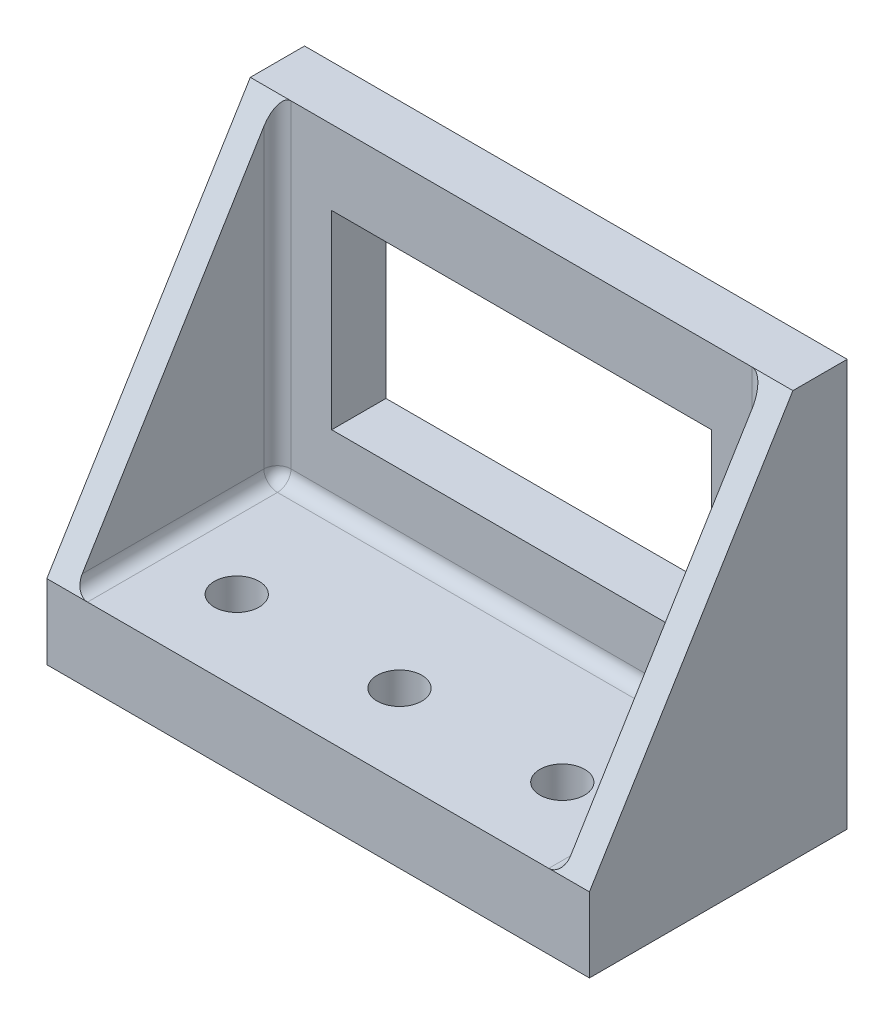
ISO-10303-21;
HEADER;
FILE_DESCRIPTION(('STEP AP214'),'2;1');
FILE_NAME('part.step','',(''),(''),'','','');
FILE_SCHEMA(('AUTOMOTIVE_DESIGN { 1 0 10303 214 1 1 1 1 }'));
ENDSEC;
DATA;
#1=APPLICATION_CONTEXT('core data for automotive mechanical design processes');
#2=APPLICATION_PROTOCOL_DEFINITION('international standard','automotive_design',2000,#1);
#3=PRODUCT_CONTEXT('',#1,'mechanical');
#4=PRODUCT('Part','Part','',(#3));
#5=PRODUCT_RELATED_PRODUCT_CATEGORY('part','',(#4));
#6=PRODUCT_DEFINITION_FORMATION('','',#4);
#7=PRODUCT_DEFINITION_CONTEXT('part definition',#1,'design');
#8=PRODUCT_DEFINITION('design','',#6,#7);
#9=PRODUCT_DEFINITION_SHAPE('','',#8);
#10=(LENGTH_UNIT() NAMED_UNIT(*) SI_UNIT(.MILLI.,.METRE.));
#11=(NAMED_UNIT(*) PLANE_ANGLE_UNIT() SI_UNIT($,.RADIAN.));
#12=(NAMED_UNIT(*) SI_UNIT($,.STERADIAN.) SOLID_ANGLE_UNIT());
#13=UNCERTAINTY_MEASURE_WITH_UNIT(LENGTH_MEASURE(1.E-05),#10,'distance_accuracy_value','');
#14=(GEOMETRIC_REPRESENTATION_CONTEXT(3) GLOBAL_UNCERTAINTY_ASSIGNED_CONTEXT((#13)) GLOBAL_UNIT_ASSIGNED_CONTEXT((#10,
#11,#12)) REPRESENTATION_CONTEXT('',''));
#15=CARTESIAN_POINT('',(0.,0.,0.));
#16=DIRECTION('',(0.,0.,1.));
#17=DIRECTION('',(1.,0.,0.));
#18=AXIS2_PLACEMENT_3D('',#15,#16,#17);
#19=CARTESIAN_POINT('',(0.,0.,4.));
#20=DIRECTION('',(0.,0.,1.));
#21=DIRECTION('',(1.,0.,0.));
#22=AXIS2_PLACEMENT_3D('',#19,#20,#21);
#23=PLANE('',#22);
#24=DIRECTION('',(1.,0.,0.));
#25=VECTOR('',#24,1.);
#26=CARTESIAN_POINT('',(-14.2222222222222,-8.77777777777778,4.));
#27=LINE('',#26,#25);
#28=CARTESIAN_POINT('',(-14.2222222222222,-8.77777777777778,4.));
#29=VERTEX_POINT('',#28);
#30=CARTESIAN_POINT('',(13.7777777777778,-8.77777777777778,4.));
#31=VERTEX_POINT('',#30);
#32=EDGE_CURVE('E165',#29,#31,#27,.T.);
#33=ORIENTED_EDGE('',*,*,#32,.F.);
#34=DIRECTION('',(0.,-1.,0.));
#35=VECTOR('',#34,1.);
#36=CARTESIAN_POINT('',(-14.2222222222222,-8.77777777777778,4.));
#37=LINE('',#36,#35);
#38=CARTESIAN_POINT('',(-14.2222222222222,5.22222222222222,4.));
#39=VERTEX_POINT('',#38);
#40=EDGE_CURVE('E197',#39,#29,#37,.T.);
#41=ORIENTED_EDGE('',*,*,#40,.F.);
#42=DIRECTION('',(-1.,0.,0.));
#43=VECTOR('',#42,1.);
#44=CARTESIAN_POINT('',(-14.2222222222222,5.22222222222222,4.));
#45=LINE('',#44,#43);
#46=CARTESIAN_POINT('',(13.7777777777778,5.22222222222222,4.));
#47=VERTEX_POINT('',#46);
#48=EDGE_CURVE('E194',#47,#39,#45,.T.);
#49=ORIENTED_EDGE('',*,*,#48,.F.);
#50=DIRECTION('',(0.,1.,0.));
#51=VECTOR('',#50,1.);
#52=CARTESIAN_POINT('',(13.7777777777778,-8.77777777777778,4.));
#53=LINE('',#52,#51);
#54=EDGE_CURVE('E191',#31,#47,#53,.T.);
#55=ORIENTED_EDGE('',*,*,#54,.F.);
#56=EDGE_LOOP('',(#33,#41,#49,#55));
#57=FACE_BOUND('',#56,.T.);
#58=DIRECTION('',(-1.,0.,0.));
#59=VECTOR('',#58,1.);
#60=CARTESIAN_POINT('',(0.,-12.7777777777778,4.));
#61=LINE('',#60,#59);
#62=CARTESIAN_POINT('',(-17.2222222222222,-12.7777777777778,4.));
#63=VERTEX_POINT('',#62);
#64=CARTESIAN_POINT('',(16.7777777777778,-12.7777777777778,4.));
#65=VERTEX_POINT('',#64);
#66=EDGE_CURVE('E268',#63,#65,#61,.F.);
#67=ORIENTED_EDGE('',*,*,#66,.T.);
#68=DIRECTION('',(0.,1.,0.));
#69=VECTOR('',#68,1.);
#70=CARTESIAN_POINT('',(16.7777777777778,0.,4.));
#71=LINE('',#70,#69);
#72=CARTESIAN_POINT('',(16.7777777777778,10.7222222222222,4.));
#73=VERTEX_POINT('',#72);
#74=EDGE_CURVE('E270',#65,#73,#71,.T.);
#75=ORIENTED_EDGE('',*,*,#74,.T.);
#76=DIRECTION('',(-1.,0.,0.));
#77=VECTOR('',#76,1.);
#78=CARTESIAN_POINT('',(-20.2222222222222,10.7222222222222,4.));
#79=LINE('',#78,#77);
#80=CARTESIAN_POINT('',(-17.2222222222222,10.7222222222222,4.));
#81=VERTEX_POINT('',#80);
#82=EDGE_CURVE('E212',#73,#81,#79,.T.);
#83=ORIENTED_EDGE('',*,*,#82,.T.);
#84=DIRECTION('',(0.,-1.,0.));
#85=VECTOR('',#84,1.);
#86=CARTESIAN_POINT('',(-17.2222222222222,0.,4.));
#87=LINE('',#86,#85);
#88=EDGE_CURVE('E266',#81,#63,#87,.T.);
#89=ORIENTED_EDGE('',*,*,#88,.T.);
#90=EDGE_LOOP('',(#67,#75,#83,#89));
#91=FACE_BOUND('',#90,.T.);
#92=ADVANCED_FACE('F34',(#57,#91),#23,.T.);
#93=CARTESIAN_POINT('',(-20.2222222222222,-13.7777777777778,19.));
#94=DIRECTION('',(0.,-1.,0.));
#95=DIRECTION('',(0.,0.,-1.));
#96=AXIS2_PLACEMENT_3D('',#93,#94,#95);
#97=PLANE('',#96);
#98=DIRECTION('',(-1.,0.,0.));
#99=VECTOR('',#98,1.);
#100=CARTESIAN_POINT('',(-20.2222222222222,-13.7777777777778,19.));
#101=LINE('',#100,#99);
#102=CARTESIAN_POINT('',(16.7777777777778,-13.7777777777778,19.));
#103=VERTEX_POINT('',#102);
#104=CARTESIAN_POINT('',(-17.2222222222222,-13.7777777777778,19.));
#105=VERTEX_POINT('',#104);
#106=EDGE_CURVE('E166',#103,#105,#101,.T.);
#107=ORIENTED_EDGE('',*,*,#106,.F.);
#108=DIRECTION('',(0.,0.,1.));
#109=VECTOR('',#108,1.);
#110=CARTESIAN_POINT('',(16.7777777777778,-13.7777777777778,4.));
#111=LINE('',#110,#109);
#112=CARTESIAN_POINT('',(16.7777777777778,-13.7777777777778,5.));
#113=VERTEX_POINT('',#112);
#114=EDGE_CURVE('E261',#103,#113,#111,.F.);
#115=ORIENTED_EDGE('',*,*,#114,.T.);
#116=DIRECTION('',(-1.,0.,0.));
#117=VECTOR('',#116,1.);
#118=CARTESIAN_POINT('',(-20.2222222222222,-13.7777777777778,5.));
#119=LINE('',#118,#117);
#120=CARTESIAN_POINT('',(-17.2222222222222,-13.7777777777778,5.));
#121=VERTEX_POINT('',#120);
#122=EDGE_CURVE('E256',#113,#121,#119,.T.);
#123=ORIENTED_EDGE('',*,*,#122,.T.);
#124=DIRECTION('',(0.,0.,-1.));
#125=VECTOR('',#124,1.);
#126=CARTESIAN_POINT('',(-17.2222222222222,-13.7777777777778,19.));
#127=LINE('',#126,#125);
#128=EDGE_CURVE('E258',#121,#105,#127,.F.);
#129=ORIENTED_EDGE('',*,*,#128,.T.);
#130=EDGE_LOOP('',(#107,#115,#123,#129));
#131=FACE_BOUND('',#130,.T.);
#132=CARTESIAN_POINT('',(-12.2222222222222,-13.7777777777778,13.));
#133=DIRECTION('',(0.,-1.,0.));
#134=DIRECTION('',(0.,0.,-1.));
#135=AXIS2_PLACEMENT_3D('',#132,#133,#134);
#136=CIRCLE('',#135,1.65);
#137=CARTESIAN_POINT('',(-12.2222222222222,-13.7777777777778,11.35));
#138=VERTEX_POINT('',#137);
#139=EDGE_CURVE('E249',#138,#138,#136,.T.);
#140=ORIENTED_EDGE('',*,*,#139,.T.);
#141=EDGE_LOOP('',(#140));
#142=FACE_BOUND('',#141,.T.);
#143=CARTESIAN_POINT('',(-0.222222222222214,-13.7777777777778,13.));
#144=DIRECTION('',(0.,-1.,0.));
#145=DIRECTION('',(0.,0.,-1.));
#146=AXIS2_PLACEMENT_3D('',#143,#144,#145);
#147=CIRCLE('',#146,1.65);
#148=CARTESIAN_POINT('',(-0.222222222222214,-13.7777777777778,11.35));
#149=VERTEX_POINT('',#148);
#150=EDGE_CURVE('E245',#149,#149,#147,.T.);
#151=ORIENTED_EDGE('',*,*,#150,.T.);
#152=EDGE_LOOP('',(#151));
#153=FACE_BOUND('',#152,.T.);
#154=CARTESIAN_POINT('',(11.7777777777778,-13.7777777777778,13.));
#155=DIRECTION('',(0.,-1.,0.));
#156=DIRECTION('',(0.,0.,-1.));
#157=AXIS2_PLACEMENT_3D('',#154,#155,#156);
#158=CIRCLE('',#157,1.65);
#159=CARTESIAN_POINT('',(11.7777777777778,-13.7777777777778,11.35));
#160=VERTEX_POINT('',#159);
#161=EDGE_CURVE('E242',#160,#160,#158,.T.);
#162=ORIENTED_EDGE('',*,*,#161,.T.);
#163=EDGE_LOOP('',(#162));
#164=FACE_BOUND('',#163,.T.);
#165=ADVANCED_FACE('F338',(#131,#142,#153,#164),#97,.F.);
#166=CARTESIAN_POINT('',(-20.2222222222222,10.7222222222222,4.));
#167=DIRECTION('',(1.,0.,0.));
#168=DIRECTION('',(0.,0.,-1.));
#169=AXIS2_PLACEMENT_3D('',#166,#167,#168);
#170=PLANE('',#169);
#171=DIRECTION('',(0.,-1.,0.));
#172=VECTOR('',#171,1.);
#173=CARTESIAN_POINT('',(-20.2222222222222,10.7222222222222,0.));
#174=LINE('',#173,#172);
#175=CARTESIAN_POINT('',(-20.2222222222222,10.7222222222222,0.));
#176=VERTEX_POINT('',#175);
#177=CARTESIAN_POINT('',(-20.2222222222222,-19.2777777777778,0.));
#178=VERTEX_POINT('',#177);
#179=EDGE_CURVE('E203',#176,#178,#174,.T.);
#180=ORIENTED_EDGE('',*,*,#179,.T.);
#181=DIRECTION('',(0.,0.,-1.));
#182=VECTOR('',#181,1.);
#183=CARTESIAN_POINT('',(-20.2222222222222,-19.2777777777778,4.));
#184=LINE('',#183,#182);
#185=CARTESIAN_POINT('',(-20.2222222222222,-19.2777777777778,19.));
#186=VERTEX_POINT('',#185);
#187=EDGE_CURVE('E226',#186,#178,#184,.T.);
#188=ORIENTED_EDGE('',*,*,#187,.F.);
#189=DIRECTION('',(0.,-1.,0.));
#190=VECTOR('',#189,1.);
#191=CARTESIAN_POINT('',(-20.2222222222222,-19.2777777777778,19.));
#192=LINE('',#191,#190);
#193=CARTESIAN_POINT('',(-20.2222222222222,-13.7777777777778,19.));
#194=VERTEX_POINT('',#193);
#195=EDGE_CURVE('E186',#194,#186,#192,.T.);
#196=ORIENTED_EDGE('',*,*,#195,.F.);
#197=DIRECTION('',(0.,-0.852851304076265,0.52215385963853));
#198=VECTOR('',#197,1.);
#199=CARTESIAN_POINT('',(-20.2222222222222,10.7222222222222,4.));
#200=LINE('',#199,#198);
#201=CARTESIAN_POINT('',(-20.2222222222222,10.7222222222222,4.));
#202=VERTEX_POINT('',#201);
#203=EDGE_CURVE('E299',#202,#194,#200,.T.);
#204=ORIENTED_EDGE('',*,*,#203,.F.);
#205=DIRECTION('',(0.,0.,-1.));
#206=VECTOR('',#205,1.);
#207=CARTESIAN_POINT('',(-20.2222222222222,10.7222222222222,4.));
#208=LINE('',#207,#206);
#209=EDGE_CURVE('E211',#202,#176,#208,.T.);
#210=ORIENTED_EDGE('',*,*,#209,.T.);
#211=EDGE_LOOP('',(#180,#188,#196,#204,#210));
#212=FACE_BOUND('',#211,.T.);
#213=ADVANCED_FACE('F313',(#212),#170,.F.);
#214=CARTESIAN_POINT('',(-20.2222222222222,-19.2777777777778,4.));
#215=DIRECTION('',(0.,1.,0.));
#216=DIRECTION('',(0.,0.,1.));
#217=AXIS2_PLACEMENT_3D('',#214,#215,#216);
#218=PLANE('',#217);
#219=DIRECTION('',(0.,0.,-1.));
#220=VECTOR('',#219,1.);
#221=CARTESIAN_POINT('',(19.7777777777778,-19.2777777777778,4.));
#222=LINE('',#221,#220);
#223=CARTESIAN_POINT('',(19.7777777777778,-19.2777777777778,19.));
#224=VERTEX_POINT('',#223);
#225=CARTESIAN_POINT('',(19.7777777777778,-19.2777777777778,0.));
#226=VERTEX_POINT('',#225);
#227=EDGE_CURVE('E224',#224,#226,#222,.T.);
#228=ORIENTED_EDGE('',*,*,#227,.F.);
#229=DIRECTION('',(1.,0.,0.));
#230=VECTOR('',#229,1.);
#231=CARTESIAN_POINT('',(-20.2222222222222,-19.2777777777778,19.));
#232=LINE('',#231,#230);
#233=EDGE_CURVE('E182',#186,#224,#232,.T.);
#234=ORIENTED_EDGE('',*,*,#233,.F.);
#235=ORIENTED_EDGE('',*,*,#187,.T.);
#236=DIRECTION('',(1.,0.,0.));
#237=VECTOR('',#236,1.);
#238=CARTESIAN_POINT('',(-20.2222222222222,-19.2777777777778,0.));
#239=LINE('',#238,#237);
#240=EDGE_CURVE('E215',#178,#226,#239,.T.);
#241=ORIENTED_EDGE('',*,*,#240,.T.);
#242=EDGE_LOOP('',(#228,#234,#235,#241));
#243=FACE_BOUND('',#242,.T.);
#244=CARTESIAN_POINT('',(-12.2222222222222,-19.2777777777778,13.));
#245=DIRECTION('',(0.,-1.,0.));
#246=DIRECTION('',(0.,0.,-1.));
#247=AXIS2_PLACEMENT_3D('',#244,#245,#246);
#248=CIRCLE('',#247,1.65);
#249=CARTESIAN_POINT('',(-12.2222222222222,-19.2777777777778,11.35));
#250=VERTEX_POINT('',#249);
#251=EDGE_CURVE('E246',#250,#250,#248,.T.);
#252=ORIENTED_EDGE('',*,*,#251,.F.);
#253=EDGE_LOOP('',(#252));
#254=FACE_BOUND('',#253,.T.);
#255=CARTESIAN_POINT('',(-0.222222222222214,-19.2777777777778,13.));
#256=DIRECTION('',(0.,-1.,0.));
#257=DIRECTION('',(0.,0.,-1.));
#258=AXIS2_PLACEMENT_3D('',#255,#256,#257);
#259=CIRCLE('',#258,1.65);
#260=CARTESIAN_POINT('',(-0.222222222222214,-19.2777777777778,11.35));
#261=VERTEX_POINT('',#260);
#262=EDGE_CURVE('E306',#261,#261,#259,.T.);
#263=ORIENTED_EDGE('',*,*,#262,.F.);
#264=EDGE_LOOP('',(#263));
#265=FACE_BOUND('',#264,.T.);
#266=CARTESIAN_POINT('',(11.7777777777778,-19.2777777777778,13.));
#267=DIRECTION('',(0.,-1.,0.));
#268=DIRECTION('',(0.,0.,-1.));
#269=AXIS2_PLACEMENT_3D('',#266,#267,#268);
#270=CIRCLE('',#269,1.65);
#271=CARTESIAN_POINT('',(11.7777777777778,-19.2777777777778,11.35));
#272=VERTEX_POINT('',#271);
#273=EDGE_CURVE('E303',#272,#272,#270,.T.);
#274=ORIENTED_EDGE('',*,*,#273,.F.);
#275=EDGE_LOOP('',(#274));
#276=FACE_BOUND('',#275,.T.);
#277=ADVANCED_FACE('F316',(#243,#254,#265,#276),#218,.F.);
#278=CARTESIAN_POINT('',(19.7777777777778,10.7222222222222,4.));
#279=DIRECTION('',(-1.,0.,0.));
#280=DIRECTION('',(0.,-1.,0.));
#281=AXIS2_PLACEMENT_3D('',#278,#279,#280);
#282=PLANE('',#281);
#283=DIRECTION('',(0.,0.,-1.));
#284=VECTOR('',#283,1.);
#285=CARTESIAN_POINT('',(19.7777777777778,10.7222222222222,4.));
#286=LINE('',#285,#284);
#287=CARTESIAN_POINT('',(19.7777777777778,10.7222222222222,4.));
#288=VERTEX_POINT('',#287);
#289=CARTESIAN_POINT('',(19.7777777777778,10.7222222222222,0.));
#290=VERTEX_POINT('',#289);
#291=EDGE_CURVE('E175',#288,#290,#286,.T.);
#292=ORIENTED_EDGE('',*,*,#291,.F.);
#293=DIRECTION('',(0.,0.852851304076265,-0.52215385963853));
#294=VECTOR('',#293,1.);
#295=CARTESIAN_POINT('',(19.7777777777778,-13.7777777777778,19.));
#296=LINE('',#295,#294);
#297=CARTESIAN_POINT('',(19.7777777777778,-13.7777777777778,19.));
#298=VERTEX_POINT('',#297);
#299=EDGE_CURVE('E160',#298,#288,#296,.T.);
#300=ORIENTED_EDGE('',*,*,#299,.F.);
#301=DIRECTION('',(0.,1.,0.));
#302=VECTOR('',#301,1.);
#303=CARTESIAN_POINT('',(19.7777777777778,-19.2777777777778,19.));
#304=LINE('',#303,#302);
#305=EDGE_CURVE('E173',#224,#298,#304,.T.);
#306=ORIENTED_EDGE('',*,*,#305,.F.);
#307=ORIENTED_EDGE('',*,*,#227,.T.);
#308=DIRECTION('',(0.,1.,0.));
#309=VECTOR('',#308,1.);
#310=CARTESIAN_POINT('',(19.7777777777778,10.7222222222222,0.));
#311=LINE('',#310,#309);
#312=EDGE_CURVE('E217',#226,#290,#311,.T.);
#313=ORIENTED_EDGE('',*,*,#312,.T.);
#314=EDGE_LOOP('',(#292,#300,#306,#307,#313));
#315=FACE_BOUND('',#314,.T.);
#316=ADVANCED_FACE('F171',(#315),#282,.F.);
#317=CARTESIAN_POINT('',(-20.2222222222222,10.7222222222222,4.));
#318=DIRECTION('',(0.,-1.,0.));
#319=DIRECTION('',(0.,0.,-1.));
#320=AXIS2_PLACEMENT_3D('',#317,#318,#319);
#321=PLANE('',#320);
#322=DIRECTION('',(-1.,0.,0.));
#323=VECTOR('',#322,1.);
#324=CARTESIAN_POINT('',(-20.2222222222222,10.7222222222222,0.));
#325=LINE('',#324,#323);
#326=EDGE_CURVE('E219',#290,#176,#325,.T.);
#327=ORIENTED_EDGE('',*,*,#326,.T.);
#328=ORIENTED_EDGE('',*,*,#209,.F.);
#329=DIRECTION('',(1.,0.,0.));
#330=VECTOR('',#329,1.);
#331=CARTESIAN_POINT('',(0.,10.7222222222222,4.));
#332=LINE('',#331,#330);
#333=EDGE_CURVE('E51',#81,#202,#332,.F.);
#334=ORIENTED_EDGE('',*,*,#333,.F.);
#335=ORIENTED_EDGE('',*,*,#82,.F.);
#336=EDGE_CURVE('E78',#288,#73,#79,.T.);
#337=ORIENTED_EDGE('',*,*,#336,.F.);
#338=ORIENTED_EDGE('',*,*,#291,.T.);
#339=EDGE_LOOP('',(#327,#328,#334,#335,#337,#338));
#340=FACE_BOUND('',#339,.T.);
#341=ADVANCED_FACE('F323',(#340),#321,.F.);
#342=CARTESIAN_POINT('',(0.,0.,0.));
#343=DIRECTION('',(0.,0.,1.));
#344=DIRECTION('',(1.,0.,0.));
#345=AXIS2_PLACEMENT_3D('',#342,#343,#344);
#346=PLANE('',#345);
#347=ORIENTED_EDGE('',*,*,#312,.F.);
#348=ORIENTED_EDGE('',*,*,#240,.F.);
#349=ORIENTED_EDGE('',*,*,#179,.F.);
#350=ORIENTED_EDGE('',*,*,#326,.F.);
#351=EDGE_LOOP('',(#347,#348,#349,#350));
#352=FACE_BOUND('',#351,.T.);
#353=DIRECTION('',(0.,-1.,0.));
#354=VECTOR('',#353,1.);
#355=CARTESIAN_POINT('',(-14.2222222222222,0.,0.));
#356=LINE('',#355,#354);
#357=CARTESIAN_POINT('',(-14.2222222222222,5.22222222222222,0.));
#358=VERTEX_POINT('',#357);
#359=CARTESIAN_POINT('',(-14.2222222222222,-8.77777777777778,0.));
#360=VERTEX_POINT('',#359);
#361=EDGE_CURVE('E235',#358,#360,#356,.T.);
#362=ORIENTED_EDGE('',*,*,#361,.T.);
#363=DIRECTION('',(1.,0.,0.));
#364=VECTOR('',#363,1.);
#365=CARTESIAN_POINT('',(0.,-8.77777777777778,0.));
#366=LINE('',#365,#364);
#367=CARTESIAN_POINT('',(13.7777777777778,-8.77777777777778,0.));
#368=VERTEX_POINT('',#367);
#369=EDGE_CURVE('E238',#360,#368,#366,.T.);
#370=ORIENTED_EDGE('',*,*,#369,.T.);
#371=DIRECTION('',(0.,1.,0.));
#372=VECTOR('',#371,1.);
#373=CARTESIAN_POINT('',(13.7777777777778,0.,0.));
#374=LINE('',#373,#372);
#375=CARTESIAN_POINT('',(13.7777777777778,5.22222222222222,0.));
#376=VERTEX_POINT('',#375);
#377=EDGE_CURVE('E229',#368,#376,#374,.T.);
#378=ORIENTED_EDGE('',*,*,#377,.T.);
#379=DIRECTION('',(-1.,0.,0.));
#380=VECTOR('',#379,1.);
#381=CARTESIAN_POINT('',(0.,5.22222222222222,0.));
#382=LINE('',#381,#380);
#383=EDGE_CURVE('E232',#376,#358,#382,.T.);
#384=ORIENTED_EDGE('',*,*,#383,.T.);
#385=EDGE_LOOP('',(#362,#370,#378,#384));
#386=FACE_BOUND('',#385,.T.);
#387=ADVANCED_FACE('F321',(#352,#386),#346,.F.);
#388=CARTESIAN_POINT('',(-14.2222222222222,-8.77777777777778,-1.5));
#389=DIRECTION('',(0.,-1.,0.));
#390=DIRECTION('',(0.,0.,-1.));
#391=AXIS2_PLACEMENT_3D('',#388,#389,#390);
#392=PLANE('',#391);
#393=DIRECTION('',(0.,0.,1.));
#394=VECTOR('',#393,1.);
#395=CARTESIAN_POINT('',(-14.2222222222222,-8.77777777777778,-1.5));
#396=LINE('',#395,#394);
#397=EDGE_CURVE('E201',#360,#29,#396,.T.);
#398=ORIENTED_EDGE('',*,*,#397,.T.);
#399=ORIENTED_EDGE('',*,*,#32,.T.);
#400=DIRECTION('',(0.,0.,1.));
#401=VECTOR('',#400,1.);
#402=CARTESIAN_POINT('',(13.7777777777778,-8.77777777777778,-1.5));
#403=LINE('',#402,#401);
#404=EDGE_CURVE('E200',#368,#31,#403,.T.);
#405=ORIENTED_EDGE('',*,*,#404,.F.);
#406=ORIENTED_EDGE('',*,*,#369,.F.);
#407=EDGE_LOOP('',(#398,#399,#405,#406));
#408=FACE_BOUND('',#407,.T.);
#409=ADVANCED_FACE('F364',(#408),#392,.F.);
#410=CARTESIAN_POINT('',(-14.2222222222222,-8.77777777777778,-1.5));
#411=DIRECTION('',(-1.,0.,0.));
#412=DIRECTION('',(0.,0.,1.));
#413=AXIS2_PLACEMENT_3D('',#410,#411,#412);
#414=PLANE('',#413);
#415=DIRECTION('',(0.,0.,1.));
#416=VECTOR('',#415,1.);
#417=CARTESIAN_POINT('',(-14.2222222222222,5.22222222222222,-1.5));
#418=LINE('',#417,#416);
#419=EDGE_CURVE('E204',#358,#39,#418,.T.);
#420=ORIENTED_EDGE('',*,*,#419,.T.);
#421=ORIENTED_EDGE('',*,*,#40,.T.);
#422=ORIENTED_EDGE('',*,*,#397,.F.);
#423=ORIENTED_EDGE('',*,*,#361,.F.);
#424=EDGE_LOOP('',(#420,#421,#422,#423));
#425=FACE_BOUND('',#424,.T.);
#426=ADVANCED_FACE('F403',(#425),#414,.F.);
#427=CARTESIAN_POINT('',(-14.2222222222222,5.22222222222222,-1.5));
#428=DIRECTION('',(0.,1.,0.));
#429=DIRECTION('',(0.,0.,1.));
#430=AXIS2_PLACEMENT_3D('',#427,#428,#429);
#431=PLANE('',#430);
#432=DIRECTION('',(0.,0.,1.));
#433=VECTOR('',#432,1.);
#434=CARTESIAN_POINT('',(13.7777777777778,5.22222222222222,-1.5));
#435=LINE('',#434,#433);
#436=EDGE_CURVE('E206',#376,#47,#435,.T.);
#437=ORIENTED_EDGE('',*,*,#436,.T.);
#438=ORIENTED_EDGE('',*,*,#48,.T.);
#439=ORIENTED_EDGE('',*,*,#419,.F.);
#440=ORIENTED_EDGE('',*,*,#383,.F.);
#441=EDGE_LOOP('',(#437,#438,#439,#440));
#442=FACE_BOUND('',#441,.T.);
#443=ADVANCED_FACE('F410',(#442),#431,.F.);
#444=CARTESIAN_POINT('',(13.7777777777778,-8.77777777777778,-1.5));
#445=DIRECTION('',(1.,0.,0.));
#446=DIRECTION('',(0.,0.,-1.));
#447=AXIS2_PLACEMENT_3D('',#444,#445,#446);
#448=PLANE('',#447);
#449=ORIENTED_EDGE('',*,*,#404,.T.);
#450=ORIENTED_EDGE('',*,*,#54,.T.);
#451=ORIENTED_EDGE('',*,*,#436,.F.);
#452=ORIENTED_EDGE('',*,*,#377,.F.);
#453=EDGE_LOOP('',(#449,#450,#451,#452));
#454=FACE_BOUND('',#453,.T.);
#455=ADVANCED_FACE('F418',(#454),#448,.F.);
#456=CARTESIAN_POINT('',(0.,0.,19.));
#457=DIRECTION('',(0.,0.,-1.));
#458=DIRECTION('',(-1.,0.,0.));
#459=AXIS2_PLACEMENT_3D('',#456,#457,#458);
#460=PLANE('',#459);
#461=EDGE_CURVE('E60',#298,#103,#101,.T.);
#462=ORIENTED_EDGE('',*,*,#461,.T.);
#463=ORIENTED_EDGE('',*,*,#106,.T.);
#464=EDGE_CURVE('E168',#105,#194,#101,.T.);
#465=ORIENTED_EDGE('',*,*,#464,.T.);
#466=ORIENTED_EDGE('',*,*,#195,.T.);
#467=ORIENTED_EDGE('',*,*,#233,.T.);
#468=ORIENTED_EDGE('',*,*,#305,.T.);
#469=EDGE_LOOP('',(#462,#463,#465,#466,#467,#468));
#470=FACE_BOUND('',#469,.T.);
#471=ADVANCED_FACE('F179',(#470),#460,.F.);
#472=CARTESIAN_POINT('',(11.7777777777778,-4.27777777777778,13.));
#473=DIRECTION('',(0.,-1.,0.));
#474=DIRECTION('',(0.,0.,-1.));
#475=AXIS2_PLACEMENT_3D('',#472,#473,#474);
#476=CYLINDRICAL_SURFACE('',#475,1.65);
#477=ORIENTED_EDGE('',*,*,#273,.T.);
#478=EDGE_LOOP('',(#477));
#479=FACE_BOUND('',#478,.T.);
#480=ORIENTED_EDGE('',*,*,#161,.F.);
#481=EDGE_LOOP('',(#480));
#482=FACE_BOUND('',#481,.T.);
#483=ADVANCED_FACE('F432',(#479,#482),#476,.F.);
#484=CARTESIAN_POINT('',(-0.222222222222214,-4.27777777777778,13.));
#485=DIRECTION('',(0.,-1.,0.));
#486=DIRECTION('',(0.,0.,-1.));
#487=AXIS2_PLACEMENT_3D('',#484,#485,#486);
#488=CYLINDRICAL_SURFACE('',#487,1.65);
#489=ORIENTED_EDGE('',*,*,#262,.T.);
#490=EDGE_LOOP('',(#489));
#491=FACE_BOUND('',#490,.T.);
#492=ORIENTED_EDGE('',*,*,#150,.F.);
#493=EDGE_LOOP('',(#492));
#494=FACE_BOUND('',#493,.T.);
#495=ADVANCED_FACE('F439',(#491,#494),#488,.F.);
#496=CARTESIAN_POINT('',(-12.2222222222222,-4.27777777777778,13.));
#497=DIRECTION('',(0.,-1.,0.));
#498=DIRECTION('',(0.,0.,-1.));
#499=AXIS2_PLACEMENT_3D('',#496,#497,#498);
#500=CYLINDRICAL_SURFACE('',#499,1.65);
#501=ORIENTED_EDGE('',*,*,#251,.T.);
#502=EDGE_LOOP('',(#501));
#503=FACE_BOUND('',#502,.T.);
#504=ORIENTED_EDGE('',*,*,#139,.F.);
#505=EDGE_LOOP('',(#504));
#506=FACE_BOUND('',#505,.T.);
#507=ADVANCED_FACE('F447',(#503,#506),#500,.F.);
#508=CARTESIAN_POINT('',(-20.2222222222222,10.7222222222222,4.));
#509=DIRECTION('',(0.,-0.52215385963853,-0.852851304076266));
#510=DIRECTION('',(0.,-0.852851304076265,0.52215385963853));
#511=AXIS2_PLACEMENT_3D('',#508,#509,#510);
#512=PLANE('',#511);
#513=DIRECTION('',(0.,-0.852851304076265,0.52215385963853));
#514=VECTOR('',#513,1.);
#515=CARTESIAN_POINT('',(-18.2222222222222,10.7222222222222,4.));
#516=LINE('',#515,#514);
#517=CARTESIAN_POINT('',(-18.2222222222222,9.08888888888889,5.));
#518=VERTEX_POINT('',#517);
#519=CARTESIAN_POINT('',(-18.2222222222222,-12.7777777777778,18.3877551020408));
#520=VERTEX_POINT('',#519);
#521=EDGE_CURVE('E176',#518,#520,#516,.T.);
#522=ORIENTED_EDGE('',*,*,#521,.F.);
#523=CARTESIAN_POINT('',(-17.2222222222222,9.08888888888889,5.));
#524=DIRECTION('',(0.,-0.52215385963853,-0.852851304076266));
#525=DIRECTION('',(0.,-0.852851304076266,0.52215385963853));
#526=AXIS2_PLACEMENT_3D('',#523,#524,#525);
#527=ELLIPSE('',#526,1.9151443229631,1.);
#528=EDGE_CURVE('E11',#518,#81,#527,.T.);
#529=ORIENTED_EDGE('',*,*,#528,.T.);
#530=ORIENTED_EDGE('',*,*,#333,.T.);
#531=ORIENTED_EDGE('',*,*,#203,.T.);
#532=ORIENTED_EDGE('',*,*,#464,.F.);
#533=CARTESIAN_POINT('',(-17.2222222222222,-12.7777777777778,18.3877551020408));
#534=DIRECTION('',(0.,-0.52215385963853,-0.852851304076266));
#535=DIRECTION('',(0.,-0.852851304076266,0.52215385963853));
#536=AXIS2_PLACEMENT_3D('',#533,#534,#535);
#537=ELLIPSE('',#536,1.17253734058965,1.);
#538=EDGE_CURVE('E273',#105,#520,#537,.T.);
#539=ORIENTED_EDGE('',*,*,#538,.T.);
#540=EDGE_LOOP('',(#522,#529,#530,#531,#532,#539));
#541=FACE_BOUND('',#540,.T.);
#542=ADVANCED_FACE('F454',(#541),#512,.F.);
#543=CARTESIAN_POINT('',(-18.2222222222222,-4.27777777777778,9.5));
#544=DIRECTION('',(-1.,0.,0.));
#545=DIRECTION('',(0.,0.,1.));
#546=AXIS2_PLACEMENT_3D('',#543,#544,#545);
#547=PLANE('',#546);
#548=ORIENTED_EDGE('',*,*,#521,.T.);
#549=DIRECTION('',(0.,0.,-1.));
#550=VECTOR('',#549,1.);
#551=CARTESIAN_POINT('',(-18.2222222222222,-12.7777777777778,4.));
#552=LINE('',#551,#550);
#553=CARTESIAN_POINT('',(-18.2222222222222,-12.7777777777778,5.));
#554=VERTEX_POINT('',#553);
#555=EDGE_CURVE('E88',#520,#554,#552,.T.);
#556=ORIENTED_EDGE('',*,*,#555,.T.);
#557=DIRECTION('',(0.,-1.,0.));
#558=VECTOR('',#557,1.);
#559=CARTESIAN_POINT('',(-18.2222222222222,-4.27777777777778,5.));
#560=LINE('',#559,#558);
#561=EDGE_CURVE('E263',#554,#518,#560,.F.);
#562=ORIENTED_EDGE('',*,*,#561,.T.);
#563=EDGE_LOOP('',(#548,#556,#562));
#564=FACE_BOUND('',#563,.T.);
#565=ADVANCED_FACE('F461',(#564),#547,.F.);
#566=CARTESIAN_POINT('',(19.7777777777778,-13.7777777777778,19.));
#567=DIRECTION('',(0.,-0.52215385963853,-0.852851304076266));
#568=DIRECTION('',(0.,0.852851304076265,-0.52215385963853));
#569=AXIS2_PLACEMENT_3D('',#566,#567,#568);
#570=PLANE('',#569);
#571=ORIENTED_EDGE('',*,*,#299,.T.);
#572=ORIENTED_EDGE('',*,*,#336,.T.);
#573=CARTESIAN_POINT('',(16.7777777777778,9.08888888888889,5.));
#574=DIRECTION('',(0.,-0.52215385963853,-0.852851304076266));
#575=DIRECTION('',(0.,0.852851304076266,-0.52215385963853));
#576=AXIS2_PLACEMENT_3D('',#573,#574,#575);
#577=ELLIPSE('',#576,1.9151443229631,1.);
#578=CARTESIAN_POINT('',(17.7777777777778,9.08888888888888,5.));
#579=VERTEX_POINT('',#578);
#580=EDGE_CURVE('E43',#73,#579,#577,.T.);
#581=ORIENTED_EDGE('',*,*,#580,.T.);
#582=DIRECTION('',(0.,0.852851304076265,-0.52215385963853));
#583=VECTOR('',#582,1.);
#584=CARTESIAN_POINT('',(17.7777777777778,-13.7777777777778,19.));
#585=LINE('',#584,#583);
#586=CARTESIAN_POINT('',(17.7777777777778,-12.7777777777778,18.3877551020408));
#587=VERTEX_POINT('',#586);
#588=EDGE_CURVE('E177',#587,#579,#585,.T.);
#589=ORIENTED_EDGE('',*,*,#588,.F.);
#590=CARTESIAN_POINT('',(16.7777777777778,-12.7777777777778,18.3877551020408));
#591=DIRECTION('',(0.,-0.52215385963853,-0.852851304076266));
#592=DIRECTION('',(0.,0.852851304076266,-0.52215385963853));
#593=AXIS2_PLACEMENT_3D('',#590,#591,#592);
#594=ELLIPSE('',#593,1.17253734058965,1.);
#595=EDGE_CURVE('E163',#587,#103,#594,.T.);
#596=ORIENTED_EDGE('',*,*,#595,.T.);
#597=ORIENTED_EDGE('',*,*,#461,.F.);
#598=EDGE_LOOP('',(#571,#572,#581,#589,#596,#597));
#599=FACE_BOUND('',#598,.T.);
#600=ADVANCED_FACE('F159',(#599),#570,.F.);
#601=CARTESIAN_POINT('',(17.7777777777778,-4.27777777777778,9.5));
#602=DIRECTION('',(1.,0.,0.));
#603=DIRECTION('',(0.,1.,0.));
#604=AXIS2_PLACEMENT_3D('',#601,#602,#603);
#605=PLANE('',#604);
#606=DIRECTION('',(0.,1.,0.));
#607=VECTOR('',#606,1.);
#608=CARTESIAN_POINT('',(17.7777777777778,-4.27777777777778,5.));
#609=LINE('',#608,#607);
#610=CARTESIAN_POINT('',(17.7777777777778,-12.7777777777778,5.));
#611=VERTEX_POINT('',#610);
#612=EDGE_CURVE('E241',#579,#611,#609,.F.);
#613=ORIENTED_EDGE('',*,*,#612,.T.);
#614=DIRECTION('',(0.,0.,1.));
#615=VECTOR('',#614,1.);
#616=CARTESIAN_POINT('',(17.7777777777778,-12.7777777777778,19.));
#617=LINE('',#616,#615);
#618=EDGE_CURVE('E253',#611,#587,#617,.T.);
#619=ORIENTED_EDGE('',*,*,#618,.T.);
#620=ORIENTED_EDGE('',*,*,#588,.T.);
#621=EDGE_LOOP('',(#613,#619,#620));
#622=FACE_BOUND('',#621,.T.);
#623=ADVANCED_FACE('F332',(#622),#605,.F.);
#624=CARTESIAN_POINT('',(-17.2222222222222,-12.7777777777778,9.5));
#625=DIRECTION('',(0.,0.,1.));
#626=DIRECTION('',(1.,0.,0.));
#627=AXIS2_PLACEMENT_3D('',#624,#625,#626);
#628=CYLINDRICAL_SURFACE('',#627,1.);
#629=ORIENTED_EDGE('',*,*,#538,.F.);
#630=ORIENTED_EDGE('',*,*,#128,.F.);
#631=CARTESIAN_POINT('',(-17.2222222222222,-12.7777777777778,5.));
#632=DIRECTION('',(0.,0.,1.));
#633=DIRECTION('',(0.,-1.,0.));
#634=AXIS2_PLACEMENT_3D('',#631,#632,#633);
#635=CIRCLE('',#634,1.);
#636=EDGE_CURVE('E38',#554,#121,#635,.T.);
#637=ORIENTED_EDGE('',*,*,#636,.F.);
#638=ORIENTED_EDGE('',*,*,#555,.F.);
#639=EDGE_LOOP('',(#629,#630,#637,#638));
#640=FACE_BOUND('',#639,.T.);
#641=ADVANCED_FACE('F36',(#640),#628,.F.);
#642=CARTESIAN_POINT('',(-17.2222222222222,0.,5.));
#643=DIRECTION('',(0.,-1.,0.));
#644=DIRECTION('',(0.,0.,-1.));
#645=AXIS2_PLACEMENT_3D('',#642,#643,#644);
#646=CYLINDRICAL_SURFACE('',#645,1.);
#647=ORIENTED_EDGE('',*,*,#528,.F.);
#648=ORIENTED_EDGE('',*,*,#561,.F.);
#649=CARTESIAN_POINT('',(-17.2222222222222,-12.7777777777778,5.));
#650=DIRECTION('',(0.,1.,0.));
#651=DIRECTION('',(0.,0.,1.));
#652=AXIS2_PLACEMENT_3D('',#649,#650,#651);
#653=CIRCLE('',#652,1.);
#654=EDGE_CURVE('E287',#63,#554,#653,.T.);
#655=ORIENTED_EDGE('',*,*,#654,.F.);
#656=ORIENTED_EDGE('',*,*,#88,.F.);
#657=EDGE_LOOP('',(#647,#648,#655,#656));
#658=FACE_BOUND('',#657,.T.);
#659=ADVANCED_FACE('F487',(#658),#646,.F.);
#660=CARTESIAN_POINT('',(-17.2222222222222,-12.7777777777778,5.));
#661=DIRECTION('',(0.,0.,1.));
#662=DIRECTION('',(1.,0.,0.));
#663=AXIS2_PLACEMENT_3D('',#660,#661,#662);
#664=SPHERICAL_SURFACE('',#663,1.);
#665=ORIENTED_EDGE('',*,*,#654,.T.);
#666=ORIENTED_EDGE('',*,*,#636,.T.);
#667=CARTESIAN_POINT('',(-17.2222222222222,-12.7777777777778,5.));
#668=DIRECTION('',(1.,0.,0.));
#669=DIRECTION('',(0.,0.,-1.));
#670=AXIS2_PLACEMENT_3D('',#667,#668,#669);
#671=CIRCLE('',#670,1.);
#672=EDGE_CURVE('E285',#63,#121,#671,.F.);
#673=ORIENTED_EDGE('',*,*,#672,.F.);
#674=EDGE_LOOP('',(#665,#666,#673));
#675=FACE_BOUND('',#674,.T.);
#676=ADVANCED_FACE('F494',(#675),#664,.F.);
#677=CARTESIAN_POINT('',(-20.2222222222222,-12.7777777777778,5.));
#678=DIRECTION('',(-1.,0.,0.));
#679=DIRECTION('',(0.,0.,1.));
#680=AXIS2_PLACEMENT_3D('',#677,#678,#679);
#681=CYLINDRICAL_SURFACE('',#680,1.);
#682=ORIENTED_EDGE('',*,*,#672,.T.);
#683=ORIENTED_EDGE('',*,*,#122,.F.);
#684=CARTESIAN_POINT('',(16.7777777777778,-12.7777777777778,5.));
#685=DIRECTION('',(-1.,0.,0.));
#686=DIRECTION('',(0.,-1.,0.));
#687=AXIS2_PLACEMENT_3D('',#684,#685,#686);
#688=CIRCLE('',#687,1.);
#689=EDGE_CURVE('E282',#65,#113,#688,.T.);
#690=ORIENTED_EDGE('',*,*,#689,.F.);
#691=ORIENTED_EDGE('',*,*,#66,.F.);
#692=EDGE_LOOP('',(#682,#683,#690,#691));
#693=FACE_BOUND('',#692,.T.);
#694=ADVANCED_FACE('F342',(#693),#681,.F.);
#695=CARTESIAN_POINT('',(16.7777777777778,0.,5.));
#696=DIRECTION('',(0.,1.,0.));
#697=DIRECTION('',(-1.,0.,0.));
#698=AXIS2_PLACEMENT_3D('',#695,#696,#697);
#699=CYLINDRICAL_SURFACE('',#698,1.);
#700=ORIENTED_EDGE('',*,*,#580,.F.);
#701=ORIENTED_EDGE('',*,*,#74,.F.);
#702=CARTESIAN_POINT('',(16.7777777777778,-12.7777777777778,5.));
#703=DIRECTION('',(0.,1.,0.));
#704=DIRECTION('',(0.,0.,1.));
#705=AXIS2_PLACEMENT_3D('',#702,#703,#704);
#706=CIRCLE('',#705,1.);
#707=EDGE_CURVE('E279',#611,#65,#706,.T.);
#708=ORIENTED_EDGE('',*,*,#707,.F.);
#709=ORIENTED_EDGE('',*,*,#612,.F.);
#710=EDGE_LOOP('',(#700,#701,#708,#709));
#711=FACE_BOUND('',#710,.T.);
#712=ADVANCED_FACE('F328',(#711),#699,.F.);
#713=CARTESIAN_POINT('',(16.7777777777778,-12.7777777777778,5.));
#714=DIRECTION('',(0.,0.,1.));
#715=DIRECTION('',(1.,0.,0.));
#716=AXIS2_PLACEMENT_3D('',#713,#714,#715);
#717=SPHERICAL_SURFACE('',#716,1.);
#718=ORIENTED_EDGE('',*,*,#707,.T.);
#719=ORIENTED_EDGE('',*,*,#689,.T.);
#720=CARTESIAN_POINT('',(16.7777777777778,-12.7777777777778,5.));
#721=DIRECTION('',(0.,0.,1.));
#722=DIRECTION('',(1.,0.,0.));
#723=AXIS2_PLACEMENT_3D('',#720,#721,#722);
#724=CIRCLE('',#723,1.);
#725=EDGE_CURVE('E276',#611,#113,#724,.F.);
#726=ORIENTED_EDGE('',*,*,#725,.F.);
#727=EDGE_LOOP('',(#718,#719,#726));
#728=FACE_BOUND('',#727,.T.);
#729=ADVANCED_FACE('F345',(#728),#717,.F.);
#730=CARTESIAN_POINT('',(16.7777777777778,-12.7777777777778,9.5));
#731=DIRECTION('',(0.,0.,-1.));
#732=DIRECTION('',(-1.,0.,0.));
#733=AXIS2_PLACEMENT_3D('',#730,#731,#732);
#734=CYLINDRICAL_SURFACE('',#733,1.);
#735=ORIENTED_EDGE('',*,*,#725,.T.);
#736=ORIENTED_EDGE('',*,*,#114,.F.);
#737=ORIENTED_EDGE('',*,*,#595,.F.);
#738=ORIENTED_EDGE('',*,*,#618,.F.);
#739=EDGE_LOOP('',(#735,#736,#737,#738));
#740=FACE_BOUND('',#739,.T.);
#741=ADVANCED_FACE('F335',(#740),#734,.F.);
#742=CLOSED_SHELL('',(#92,#165,#213,#277,#316,#341,#387,#409,#426,#443,#455,#471,#483,#495,#507,
#542,#565,#600,#623,#641,#659,#676,#694,#712,#729,#741));
#743=MANIFOLD_SOLID_BREP('B2',#742);
#744=ADVANCED_BREP_SHAPE_REPRESENTATION('',(#18,#743),#14);
#745=SHAPE_DEFINITION_REPRESENTATION(#9,#744);
ENDSEC;
END-ISO-10303-21;
